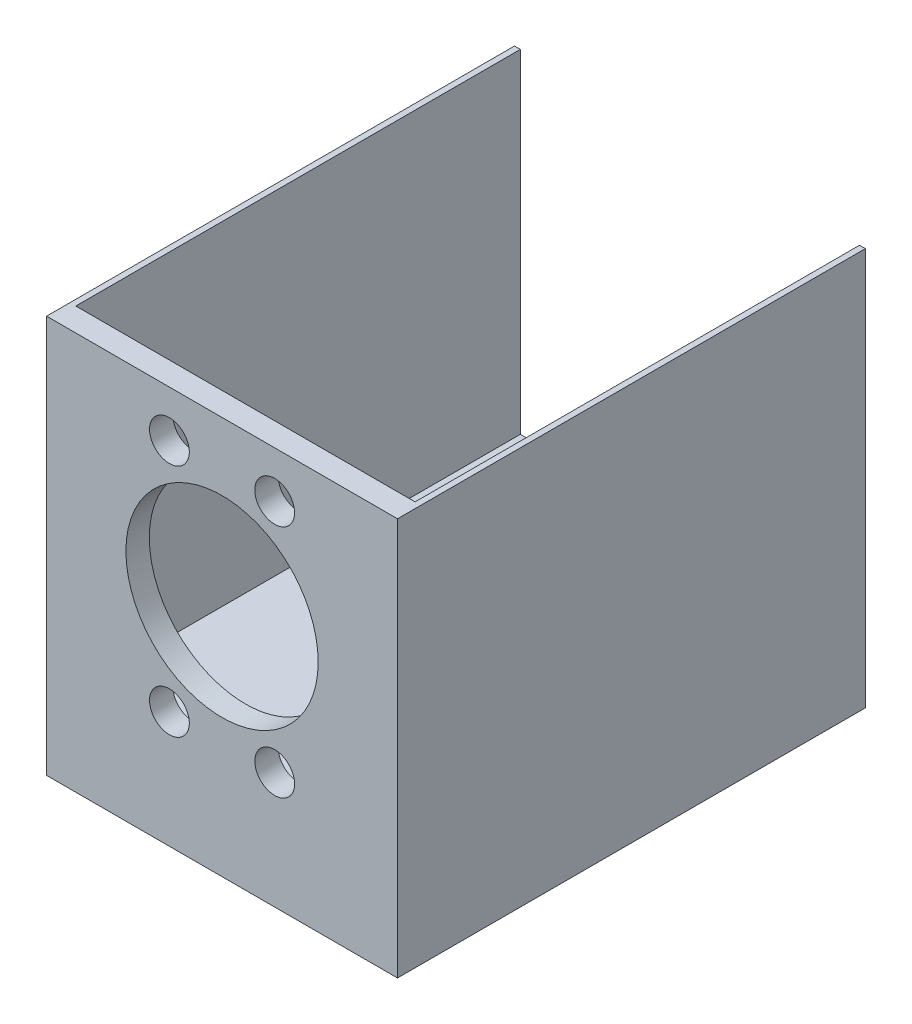
ISO-10303-21;
HEADER;
FILE_DESCRIPTION(('STEP AP214'),'2;1');
FILE_NAME('part.step','',(''),(''),'','','');
FILE_SCHEMA(('AUTOMOTIVE_DESIGN { 1 0 10303 214 1 1 1 1 }'));
ENDSEC;
DATA;
#1=APPLICATION_CONTEXT('core data for automotive mechanical design processes');
#2=APPLICATION_PROTOCOL_DEFINITION('international standard','automotive_design',2000,#1);
#3=PRODUCT_CONTEXT('',#1,'mechanical');
#4=PRODUCT('Part','Part','',(#3));
#5=PRODUCT_RELATED_PRODUCT_CATEGORY('part','',(#4));
#6=PRODUCT_DEFINITION_FORMATION('','',#4);
#7=PRODUCT_DEFINITION_CONTEXT('part definition',#1,'design');
#8=PRODUCT_DEFINITION('design','',#6,#7);
#9=PRODUCT_DEFINITION_SHAPE('','',#8);
#10=(LENGTH_UNIT() NAMED_UNIT(*) SI_UNIT(.MILLI.,.METRE.));
#11=(NAMED_UNIT(*) PLANE_ANGLE_UNIT() SI_UNIT($,.RADIAN.));
#12=(NAMED_UNIT(*) SI_UNIT($,.STERADIAN.) SOLID_ANGLE_UNIT());
#13=UNCERTAINTY_MEASURE_WITH_UNIT(LENGTH_MEASURE(1.E-05),#10,'distance_accuracy_value','');
#14=(GEOMETRIC_REPRESENTATION_CONTEXT(3) GLOBAL_UNCERTAINTY_ASSIGNED_CONTEXT((#13)) GLOBAL_UNIT_ASSIGNED_CONTEXT((#10,
#11,#12)) REPRESENTATION_CONTEXT('',''));
#15=CARTESIAN_POINT('',(0.,0.,0.));
#16=DIRECTION('',(0.,0.,1.));
#17=DIRECTION('',(1.,0.,0.));
#18=AXIS2_PLACEMENT_3D('',#15,#16,#17);
#19=CARTESIAN_POINT('',(15.,-15.,-40.));
#20=DIRECTION('',(1.,0.,0.));
#21=DIRECTION('',(0.,0.,-1.));
#22=AXIS2_PLACEMENT_3D('',#19,#20,#21);
#23=PLANE('',#22);
#24=DIRECTION('',(0.,1.,0.));
#25=VECTOR('',#24,1.);
#26=CARTESIAN_POINT('',(15.,-15.,-40.));
#27=LINE('',#26,#25);
#28=CARTESIAN_POINT('',(15.,-20.,-40.));
#29=VERTEX_POINT('',#28);
#30=CARTESIAN_POINT('',(15.,14.,-40.));
#31=VERTEX_POINT('',#30);
#32=EDGE_CURVE('E111',#29,#31,#27,.T.);
#33=ORIENTED_EDGE('',*,*,#32,.T.);
#34=DIRECTION('',(0.,0.,-1.));
#35=VECTOR('',#34,1.);
#36=CARTESIAN_POINT('',(15.,14.,-40.));
#37=LINE('',#36,#35);
#38=CARTESIAN_POINT('',(15.,14.,0.));
#39=VERTEX_POINT('',#38);
#40=EDGE_CURVE('E154',#39,#31,#37,.T.);
#41=ORIENTED_EDGE('',*,*,#40,.F.);
#42=DIRECTION('',(0.,1.,0.));
#43=VECTOR('',#42,1.);
#44=CARTESIAN_POINT('',(15.,-15.,0.));
#45=LINE('',#44,#43);
#46=CARTESIAN_POINT('',(15.,-20.,0.));
#47=VERTEX_POINT('',#46);
#48=EDGE_CURVE('E83',#47,#39,#45,.T.);
#49=ORIENTED_EDGE('',*,*,#48,.F.);
#50=DIRECTION('',(0.,0.,1.));
#51=VECTOR('',#50,1.);
#52=CARTESIAN_POINT('',(15.,-20.,0.));
#53=LINE('',#52,#51);
#54=EDGE_CURVE('E205',#29,#47,#53,.T.);
#55=ORIENTED_EDGE('',*,*,#54,.F.);
#56=EDGE_LOOP('',(#33,#41,#49,#55));
#57=FACE_BOUND('',#56,.T.);
#58=ADVANCED_FACE('F39',(#57),#23,.T.);
#59=CARTESIAN_POINT('',(-15.,-15.,-40.));
#60=DIRECTION('',(-1.,0.,0.));
#61=DIRECTION('',(0.,0.,1.));
#62=AXIS2_PLACEMENT_3D('',#59,#60,#61);
#63=PLANE('',#62);
#64=DIRECTION('',(0.,-1.,0.));
#65=VECTOR('',#64,1.);
#66=CARTESIAN_POINT('',(-15.,-15.,0.));
#67=LINE('',#66,#65);
#68=CARTESIAN_POINT('',(-15.,14.,0.));
#69=VERTEX_POINT('',#68);
#70=CARTESIAN_POINT('',(-15.,-20.,0.));
#71=VERTEX_POINT('',#70);
#72=EDGE_CURVE('E114',#69,#71,#67,.T.);
#73=ORIENTED_EDGE('',*,*,#72,.F.);
#74=DIRECTION('',(0.,0.,1.));
#75=VECTOR('',#74,1.);
#76=CARTESIAN_POINT('',(-15.,14.,-40.));
#77=LINE('',#76,#75);
#78=CARTESIAN_POINT('',(-15.,14.,-40.));
#79=VERTEX_POINT('',#78);
#80=EDGE_CURVE('E144',#79,#69,#77,.T.);
#81=ORIENTED_EDGE('',*,*,#80,.F.);
#82=DIRECTION('',(0.,-1.,0.));
#83=VECTOR('',#82,1.);
#84=CARTESIAN_POINT('',(-15.,-15.,-40.));
#85=LINE('',#84,#83);
#86=CARTESIAN_POINT('',(-15.,-20.,-40.));
#87=VERTEX_POINT('',#86);
#88=EDGE_CURVE('E47',#79,#87,#85,.T.);
#89=ORIENTED_EDGE('',*,*,#88,.T.);
#90=DIRECTION('',(0.,0.,-1.));
#91=VECTOR('',#90,1.);
#92=CARTESIAN_POINT('',(-15.,-20.,-40.));
#93=LINE('',#92,#91);
#94=EDGE_CURVE('E214',#71,#87,#93,.T.);
#95=ORIENTED_EDGE('',*,*,#94,.F.);
#96=EDGE_LOOP('',(#73,#81,#89,#95));
#97=FACE_BOUND('',#96,.T.);
#98=ADVANCED_FACE('F287',(#97),#63,.T.);
#99=CARTESIAN_POINT('',(0.,0.,-40.));
#100=DIRECTION('',(0.,0.,-1.));
#101=DIRECTION('',(-1.,0.,0.));
#102=AXIS2_PLACEMENT_3D('',#99,#100,#101);
#103=PLANE('',#102);
#104=ORIENTED_EDGE('',*,*,#88,.F.);
#105=DIRECTION('',(-1.,0.,0.));
#106=VECTOR('',#105,1.);
#107=CARTESIAN_POINT('',(-15.,14.,-40.));
#108=LINE('',#107,#106);
#109=CARTESIAN_POINT('',(-14.5,14.,-40.));
#110=VERTEX_POINT('',#109);
#111=EDGE_CURVE('E99',#110,#79,#108,.T.);
#112=ORIENTED_EDGE('',*,*,#111,.F.);
#113=DIRECTION('',(0.,1.,0.));
#114=VECTOR('',#113,1.);
#115=CARTESIAN_POINT('',(-14.5,-14.5,-40.));
#116=LINE('',#115,#114);
#117=CARTESIAN_POINT('',(-14.5,-14.5,-40.));
#118=VERTEX_POINT('',#117);
#119=EDGE_CURVE('E79',#118,#110,#116,.T.);
#120=ORIENTED_EDGE('',*,*,#119,.F.);
#121=DIRECTION('',(-1.,0.,0.));
#122=VECTOR('',#121,1.);
#123=CARTESIAN_POINT('',(14.5,-14.5,-40.));
#124=LINE('',#123,#122);
#125=CARTESIAN_POINT('',(14.5,-14.5,-40.));
#126=VERTEX_POINT('',#125);
#127=EDGE_CURVE('E88',#126,#118,#124,.T.);
#128=ORIENTED_EDGE('',*,*,#127,.F.);
#129=DIRECTION('',(0.,-1.,0.));
#130=VECTOR('',#129,1.);
#131=CARTESIAN_POINT('',(14.5,-14.5,-40.));
#132=LINE('',#131,#130);
#133=CARTESIAN_POINT('',(14.5,14.,-40.));
#134=VERTEX_POINT('',#133);
#135=EDGE_CURVE('E93',#134,#126,#132,.T.);
#136=ORIENTED_EDGE('',*,*,#135,.F.);
#137=EDGE_CURVE('E162',#31,#134,#108,.T.);
#138=ORIENTED_EDGE('',*,*,#137,.F.);
#139=ORIENTED_EDGE('',*,*,#32,.F.);
#140=DIRECTION('',(1.,0.,0.));
#141=VECTOR('',#140,1.);
#142=CARTESIAN_POINT('',(-14.5,-20.,-40.));
#143=LINE('',#142,#141);
#144=EDGE_CURVE('E220',#87,#29,#143,.T.);
#145=ORIENTED_EDGE('',*,*,#144,.F.);
#146=EDGE_LOOP('',(#104,#112,#120,#128,#136,#138,#139,#145));
#147=FACE_BOUND('',#146,.T.);
#148=ADVANCED_FACE('F97',(#147),#103,.T.);
#149=CARTESIAN_POINT('',(0.,0.,0.));
#150=DIRECTION('',(0.,0.,-1.));
#151=DIRECTION('',(-1.,0.,0.));
#152=AXIS2_PLACEMENT_3D('',#149,#150,#151);
#153=PLANE('',#152);
#154=CARTESIAN_POINT('',(1.13743898277129E-13,0.,0.));
#155=DIRECTION('',(0.,0.,-1.));
#156=DIRECTION('',(-1.,0.,0.));
#157=AXIS2_PLACEMENT_3D('',#154,#155,#156);
#158=CIRCLE('',#157,8.21779709980826);
#159=CARTESIAN_POINT('',(-8.21779709980814,0.,0.));
#160=VERTEX_POINT('',#159);
#161=EDGE_CURVE('E137',#160,#160,#158,.T.);
#162=ORIENTED_EDGE('',*,*,#161,.T.);
#163=EDGE_LOOP('',(#162));
#164=FACE_BOUND('',#163,.T.);
#165=CARTESIAN_POINT('',(-4.5,-10.0374299499424,0.));
#166=DIRECTION('',(0.,0.,-1.));
#167=DIRECTION('',(-1.,0.,0.));
#168=AXIS2_PLACEMENT_3D('',#165,#166,#167);
#169=CIRCLE('',#168,1.69999999999999);
#170=CARTESIAN_POINT('',(-6.19999999999999,-10.0374299499424,0.));
#171=VERTEX_POINT('',#170);
#172=EDGE_CURVE('E104',#171,#171,#169,.T.);
#173=ORIENTED_EDGE('',*,*,#172,.T.);
#174=EDGE_LOOP('',(#173));
#175=FACE_BOUND('',#174,.T.);
#176=CARTESIAN_POINT('',(4.5,-10.0374299499424,0.));
#177=DIRECTION('',(0.,0.,-1.));
#178=DIRECTION('',(-1.,0.,0.));
#179=AXIS2_PLACEMENT_3D('',#176,#177,#178);
#180=CIRCLE('',#179,1.69999999999999);
#181=CARTESIAN_POINT('',(2.80000000000001,-10.0374299499424,0.));
#182=VERTEX_POINT('',#181);
#183=EDGE_CURVE('E124',#182,#182,#180,.T.);
#184=ORIENTED_EDGE('',*,*,#183,.T.);
#185=EDGE_LOOP('',(#184));
#186=FACE_BOUND('',#185,.T.);
#187=CARTESIAN_POINT('',(4.5,10.0374299499424,0.));
#188=DIRECTION('',(0.,0.,-1.));
#189=DIRECTION('',(-1.,0.,0.));
#190=AXIS2_PLACEMENT_3D('',#187,#188,#189);
#191=CIRCLE('',#190,1.69999999999999);
#192=CARTESIAN_POINT('',(2.80000000000001,10.0374299499424,0.));
#193=VERTEX_POINT('',#192);
#194=EDGE_CURVE('E128',#193,#193,#191,.T.);
#195=ORIENTED_EDGE('',*,*,#194,.T.);
#196=EDGE_LOOP('',(#195));
#197=FACE_BOUND('',#196,.T.);
#198=CARTESIAN_POINT('',(-4.5,10.0374299499424,0.));
#199=DIRECTION('',(0.,0.,-1.));
#200=DIRECTION('',(-1.,0.,0.));
#201=AXIS2_PLACEMENT_3D('',#198,#199,#200);
#202=CIRCLE('',#201,1.69999999999999);
#203=CARTESIAN_POINT('',(-6.19999999999999,10.0374299499424,0.));
#204=VERTEX_POINT('',#203);
#205=EDGE_CURVE('E131',#204,#204,#202,.T.);
#206=ORIENTED_EDGE('',*,*,#205,.T.);
#207=EDGE_LOOP('',(#206));
#208=FACE_BOUND('',#207,.T.);
#209=DIRECTION('',(1.,0.,0.));
#210=VECTOR('',#209,1.);
#211=CARTESIAN_POINT('',(-15.,14.,0.));
#212=LINE('',#211,#210);
#213=EDGE_CURVE('E148',#69,#39,#212,.T.);
#214=ORIENTED_EDGE('',*,*,#213,.F.);
#215=ORIENTED_EDGE('',*,*,#72,.T.);
#216=DIRECTION('',(-1.,0.,0.));
#217=VECTOR('',#216,1.);
#218=CARTESIAN_POINT('',(-15.,-20.,0.));
#219=LINE('',#218,#217);
#220=EDGE_CURVE('E208',#47,#71,#219,.T.);
#221=ORIENTED_EDGE('',*,*,#220,.F.);
#222=ORIENTED_EDGE('',*,*,#48,.T.);
#223=EDGE_LOOP('',(#214,#215,#221,#222));
#224=FACE_BOUND('',#223,.T.);
#225=ADVANCED_FACE('F209',(#164,#175,#186,#197,#208,#224),#153,.F.);
#226=CARTESIAN_POINT('',(-14.5,-14.5,-2.));
#227=DIRECTION('',(-1.,0.,0.));
#228=DIRECTION('',(0.,0.,1.));
#229=AXIS2_PLACEMENT_3D('',#226,#227,#228);
#230=PLANE('',#229);
#231=DIRECTION('',(0.,0.,-1.));
#232=VECTOR('',#231,1.);
#233=CARTESIAN_POINT('',(-14.5,14.,-2.));
#234=LINE('',#233,#232);
#235=CARTESIAN_POINT('',(-14.5,14.,-2.));
#236=VERTEX_POINT('',#235);
#237=EDGE_CURVE('E165',#236,#110,#234,.T.);
#238=ORIENTED_EDGE('',*,*,#237,.F.);
#239=DIRECTION('',(0.,1.,0.));
#240=VECTOR('',#239,1.);
#241=CARTESIAN_POINT('',(-14.5,-14.5,-2.));
#242=LINE('',#241,#240);
#243=CARTESIAN_POINT('',(-14.5,-14.5,-2.));
#244=VERTEX_POINT('',#243);
#245=EDGE_CURVE('E81',#244,#236,#242,.T.);
#246=ORIENTED_EDGE('',*,*,#245,.F.);
#247=DIRECTION('',(0.,0.,-1.));
#248=VECTOR('',#247,1.);
#249=CARTESIAN_POINT('',(-14.5,-14.5,-2.));
#250=LINE('',#249,#248);
#251=EDGE_CURVE('E63',#244,#118,#250,.T.);
#252=ORIENTED_EDGE('',*,*,#251,.T.);
#253=ORIENTED_EDGE('',*,*,#119,.T.);
#254=EDGE_LOOP('',(#238,#246,#252,#253));
#255=FACE_BOUND('',#254,.T.);
#256=ADVANCED_FACE('F76',(#255),#230,.F.);
#257=CARTESIAN_POINT('',(14.5,-14.5,-2.));
#258=DIRECTION('',(1.,0.,0.));
#259=DIRECTION('',(0.,0.,-1.));
#260=AXIS2_PLACEMENT_3D('',#257,#258,#259);
#261=PLANE('',#260);
#262=DIRECTION('',(0.,0.,1.));
#263=VECTOR('',#262,1.);
#264=CARTESIAN_POINT('',(14.5,14.,-2.));
#265=LINE('',#264,#263);
#266=CARTESIAN_POINT('',(14.5,14.,-2.));
#267=VERTEX_POINT('',#266);
#268=EDGE_CURVE('E54',#134,#267,#265,.T.);
#269=ORIENTED_EDGE('',*,*,#268,.F.);
#270=ORIENTED_EDGE('',*,*,#135,.T.);
#271=DIRECTION('',(0.,0.,-1.));
#272=VECTOR('',#271,1.);
#273=CARTESIAN_POINT('',(14.5,-14.5,-2.));
#274=LINE('',#273,#272);
#275=CARTESIAN_POINT('',(14.5,-14.5,-2.));
#276=VERTEX_POINT('',#275);
#277=EDGE_CURVE('E84',#276,#126,#274,.T.);
#278=ORIENTED_EDGE('',*,*,#277,.F.);
#279=DIRECTION('',(0.,-1.,0.));
#280=VECTOR('',#279,1.);
#281=CARTESIAN_POINT('',(14.5,-14.5,-2.));
#282=LINE('',#281,#280);
#283=EDGE_CURVE('E176',#267,#276,#282,.T.);
#284=ORIENTED_EDGE('',*,*,#283,.F.);
#285=EDGE_LOOP('',(#269,#270,#278,#284));
#286=FACE_BOUND('',#285,.T.);
#287=ADVANCED_FACE('F274',(#286),#261,.F.);
#288=CARTESIAN_POINT('',(0.,0.,-2.));
#289=DIRECTION('',(0.,0.,1.));
#290=DIRECTION('',(1.,0.,0.));
#291=AXIS2_PLACEMENT_3D('',#288,#289,#290);
#292=PLANE('',#291);
#293=CARTESIAN_POINT('',(1.13743898277129E-13,0.,-2.));
#294=DIRECTION('',(0.,0.,1.));
#295=DIRECTION('',(1.,0.,0.));
#296=AXIS2_PLACEMENT_3D('',#293,#294,#295);
#297=CIRCLE('',#296,8.21779709980826);
#298=CARTESIAN_POINT('',(8.21779709980837,0.,-2.));
#299=VERTEX_POINT('',#298);
#300=EDGE_CURVE('E42',#299,#299,#297,.T.);
#301=ORIENTED_EDGE('',*,*,#300,.T.);
#302=EDGE_LOOP('',(#301));
#303=FACE_BOUND('',#302,.T.);
#304=CARTESIAN_POINT('',(-4.5,-10.0374299499424,-2.));
#305=DIRECTION('',(0.,0.,1.));
#306=DIRECTION('',(1.,0.,0.));
#307=AXIS2_PLACEMENT_3D('',#304,#305,#306);
#308=CIRCLE('',#307,1.69999999999999);
#309=CARTESIAN_POINT('',(-2.8,-10.0374299499424,-2.));
#310=VERTEX_POINT('',#309);
#311=EDGE_CURVE('E100',#310,#310,#308,.T.);
#312=ORIENTED_EDGE('',*,*,#311,.T.);
#313=EDGE_LOOP('',(#312));
#314=FACE_BOUND('',#313,.T.);
#315=CARTESIAN_POINT('',(4.5,-10.0374299499424,-2.));
#316=DIRECTION('',(0.,0.,1.));
#317=DIRECTION('',(1.,0.,0.));
#318=AXIS2_PLACEMENT_3D('',#315,#316,#317);
#319=CIRCLE('',#318,1.69999999999999);
#320=CARTESIAN_POINT('',(6.2,-10.0374299499424,-2.));
#321=VERTEX_POINT('',#320);
#322=EDGE_CURVE('E121',#321,#321,#319,.T.);
#323=ORIENTED_EDGE('',*,*,#322,.T.);
#324=EDGE_LOOP('',(#323));
#325=FACE_BOUND('',#324,.T.);
#326=CARTESIAN_POINT('',(4.5,10.0374299499424,-2.));
#327=DIRECTION('',(0.,0.,1.));
#328=DIRECTION('',(1.,0.,0.));
#329=AXIS2_PLACEMENT_3D('',#326,#327,#328);
#330=CIRCLE('',#329,1.69999999999999);
#331=CARTESIAN_POINT('',(6.2,10.0374299499424,-2.));
#332=VERTEX_POINT('',#331);
#333=EDGE_CURVE('E125',#332,#332,#330,.T.);
#334=ORIENTED_EDGE('',*,*,#333,.T.);
#335=EDGE_LOOP('',(#334));
#336=FACE_BOUND('',#335,.T.);
#337=CARTESIAN_POINT('',(-4.5,10.0374299499424,-2.));
#338=DIRECTION('',(0.,0.,1.));
#339=DIRECTION('',(1.,0.,0.));
#340=AXIS2_PLACEMENT_3D('',#337,#338,#339);
#341=CIRCLE('',#340,1.69999999999999);
#342=CARTESIAN_POINT('',(-2.8,10.0374299499424,-2.));
#343=VERTEX_POINT('',#342);
#344=EDGE_CURVE('E129',#343,#343,#341,.T.);
#345=ORIENTED_EDGE('',*,*,#344,.T.);
#346=EDGE_LOOP('',(#345));
#347=FACE_BOUND('',#346,.T.);
#348=DIRECTION('',(-1.,0.,0.));
#349=VECTOR('',#348,1.);
#350=CARTESIAN_POINT('',(0.,14.,-2.));
#351=LINE('',#350,#349);
#352=EDGE_CURVE('E11',#267,#236,#351,.T.);
#353=ORIENTED_EDGE('',*,*,#352,.F.);
#354=ORIENTED_EDGE('',*,*,#283,.T.);
#355=DIRECTION('',(-1.,0.,0.));
#356=VECTOR('',#355,1.);
#357=CARTESIAN_POINT('',(14.5,-14.5,-2.));
#358=LINE('',#357,#356);
#359=EDGE_CURVE('E107',#276,#244,#358,.T.);
#360=ORIENTED_EDGE('',*,*,#359,.T.);
#361=ORIENTED_EDGE('',*,*,#245,.T.);
#362=EDGE_LOOP('',(#353,#354,#360,#361));
#363=FACE_BOUND('',#362,.T.);
#364=ADVANCED_FACE('F179',(#303,#314,#325,#336,#347,#363),#292,.F.);
#365=CARTESIAN_POINT('',(14.5,-14.5,-2.));
#366=DIRECTION('',(0.,-1.,0.));
#367=DIRECTION('',(0.,0.,-1.));
#368=AXIS2_PLACEMENT_3D('',#365,#366,#367);
#369=PLANE('',#368);
#370=CARTESIAN_POINT('',(12.,-14.5,-4.99999999999999));
#371=DIRECTION('',(0.,-1.,0.));
#372=DIRECTION('',(0.,0.,-1.));
#373=AXIS2_PLACEMENT_3D('',#370,#371,#372);
#374=CIRCLE('',#373,1.55);
#375=CARTESIAN_POINT('',(12.,-14.5,-6.54999999999999));
#376=VERTEX_POINT('',#375);
#377=EDGE_CURVE('E142',#376,#376,#374,.T.);
#378=ORIENTED_EDGE('',*,*,#377,.T.);
#379=EDGE_LOOP('',(#378));
#380=FACE_BOUND('',#379,.T.);
#381=CARTESIAN_POINT('',(12.,-14.5,-37.));
#382=DIRECTION('',(0.,-1.,0.));
#383=DIRECTION('',(0.,0.,-1.));
#384=AXIS2_PLACEMENT_3D('',#381,#382,#383);
#385=CIRCLE('',#384,1.55);
#386=CARTESIAN_POINT('',(12.,-14.5,-38.55));
#387=VERTEX_POINT('',#386);
#388=EDGE_CURVE('E140',#387,#387,#385,.T.);
#389=ORIENTED_EDGE('',*,*,#388,.T.);
#390=EDGE_LOOP('',(#389));
#391=FACE_BOUND('',#390,.T.);
#392=CARTESIAN_POINT('',(-12.,-14.5,-37.));
#393=DIRECTION('',(0.,-1.,0.));
#394=DIRECTION('',(0.,0.,-1.));
#395=AXIS2_PLACEMENT_3D('',#392,#393,#394);
#396=CIRCLE('',#395,1.55);
#397=CARTESIAN_POINT('',(-12.,-14.5,-38.55));
#398=VERTEX_POINT('',#397);
#399=EDGE_CURVE('E136',#398,#398,#396,.T.);
#400=ORIENTED_EDGE('',*,*,#399,.T.);
#401=EDGE_LOOP('',(#400));
#402=FACE_BOUND('',#401,.T.);
#403=CARTESIAN_POINT('',(-12.,-14.5,-5.));
#404=DIRECTION('',(0.,-1.,0.));
#405=DIRECTION('',(0.,0.,-1.));
#406=AXIS2_PLACEMENT_3D('',#403,#404,#405);
#407=CIRCLE('',#406,1.55);
#408=CARTESIAN_POINT('',(-12.,-14.5,-6.55));
#409=VERTEX_POINT('',#408);
#410=EDGE_CURVE('E133',#409,#409,#407,.T.);
#411=ORIENTED_EDGE('',*,*,#410,.T.);
#412=EDGE_LOOP('',(#411));
#413=FACE_BOUND('',#412,.T.);
#414=ORIENTED_EDGE('',*,*,#127,.T.);
#415=ORIENTED_EDGE('',*,*,#251,.F.);
#416=ORIENTED_EDGE('',*,*,#359,.F.);
#417=ORIENTED_EDGE('',*,*,#277,.T.);
#418=EDGE_LOOP('',(#414,#415,#416,#417));
#419=FACE_BOUND('',#418,.T.);
#420=ADVANCED_FACE('F89',(#380,#391,#402,#413,#419),#369,.F.);
#421=CARTESIAN_POINT('',(-4.5,-10.0374299499424,-40.));
#422=DIRECTION('',(0.,0.,-1.));
#423=DIRECTION('',(-1.,0.,0.));
#424=AXIS2_PLACEMENT_3D('',#421,#422,#423);
#425=CYLINDRICAL_SURFACE('',#424,1.69999999999999);
#426=ORIENTED_EDGE('',*,*,#172,.F.);
#427=EDGE_LOOP('',(#426));
#428=FACE_BOUND('',#427,.T.);
#429=ORIENTED_EDGE('',*,*,#311,.F.);
#430=EDGE_LOOP('',(#429));
#431=FACE_BOUND('',#430,.T.);
#432=ADVANCED_FACE('F280',(#428,#431),#425,.F.);
#433=CARTESIAN_POINT('',(4.5,-10.0374299499424,-40.));
#434=DIRECTION('',(0.,0.,-1.));
#435=DIRECTION('',(-1.,0.,0.));
#436=AXIS2_PLACEMENT_3D('',#433,#434,#435);
#437=CYLINDRICAL_SURFACE('',#436,1.69999999999999);
#438=ORIENTED_EDGE('',*,*,#183,.F.);
#439=EDGE_LOOP('',(#438));
#440=FACE_BOUND('',#439,.T.);
#441=ORIENTED_EDGE('',*,*,#322,.F.);
#442=EDGE_LOOP('',(#441));
#443=FACE_BOUND('',#442,.T.);
#444=ADVANCED_FACE('F480',(#440,#443),#437,.F.);
#445=CARTESIAN_POINT('',(4.5,10.0374299499424,-40.));
#446=DIRECTION('',(0.,0.,-1.));
#447=DIRECTION('',(-1.,0.,0.));
#448=AXIS2_PLACEMENT_3D('',#445,#446,#447);
#449=CYLINDRICAL_SURFACE('',#448,1.69999999999999);
#450=ORIENTED_EDGE('',*,*,#194,.F.);
#451=EDGE_LOOP('',(#450));
#452=FACE_BOUND('',#451,.T.);
#453=ORIENTED_EDGE('',*,*,#333,.F.);
#454=EDGE_LOOP('',(#453));
#455=FACE_BOUND('',#454,.T.);
#456=ADVANCED_FACE('F269',(#452,#455),#449,.F.);
#457=CARTESIAN_POINT('',(-4.5,10.0374299499424,-40.));
#458=DIRECTION('',(0.,0.,-1.));
#459=DIRECTION('',(-1.,0.,0.));
#460=AXIS2_PLACEMENT_3D('',#457,#458,#459);
#461=CYLINDRICAL_SURFACE('',#460,1.69999999999999);
#462=ORIENTED_EDGE('',*,*,#205,.F.);
#463=EDGE_LOOP('',(#462));
#464=FACE_BOUND('',#463,.T.);
#465=ORIENTED_EDGE('',*,*,#344,.F.);
#466=EDGE_LOOP('',(#465));
#467=FACE_BOUND('',#466,.T.);
#468=ADVANCED_FACE('F265',(#464,#467),#461,.F.);
#469=CARTESIAN_POINT('',(0.,14.,0.));
#470=DIRECTION('',(0.,1.,0.));
#471=DIRECTION('',(0.,0.,1.));
#472=AXIS2_PLACEMENT_3D('',#469,#470,#471);
#473=PLANE('',#472);
#474=ORIENTED_EDGE('',*,*,#237,.T.);
#475=ORIENTED_EDGE('',*,*,#111,.T.);
#476=ORIENTED_EDGE('',*,*,#80,.T.);
#477=ORIENTED_EDGE('',*,*,#213,.T.);
#478=ORIENTED_EDGE('',*,*,#40,.T.);
#479=ORIENTED_EDGE('',*,*,#137,.T.);
#480=ORIENTED_EDGE('',*,*,#268,.T.);
#481=ORIENTED_EDGE('',*,*,#352,.T.);
#482=EDGE_LOOP('',(#474,#475,#476,#477,#478,#479,#480,#481));
#483=FACE_BOUND('',#482,.T.);
#484=ADVANCED_FACE('F268',(#483),#473,.T.);
#485=CARTESIAN_POINT('',(-12.,-14.,-5.));
#486=DIRECTION('',(0.,-1.,0.));
#487=DIRECTION('',(0.,0.,-1.));
#488=AXIS2_PLACEMENT_3D('',#485,#486,#487);
#489=CYLINDRICAL_SURFACE('',#488,1.55);
#490=CARTESIAN_POINT('',(-12.,-15.,-5.));
#491=DIRECTION('',(0.,-1.,0.));
#492=DIRECTION('',(0.,0.,-1.));
#493=AXIS2_PLACEMENT_3D('',#490,#491,#492);
#494=CIRCLE('',#493,1.55);
#495=CARTESIAN_POINT('',(-12.,-15.,-6.55));
#496=VERTEX_POINT('',#495);
#497=EDGE_CURVE('E157',#496,#496,#494,.T.);
#498=ORIENTED_EDGE('',*,*,#497,.T.);
#499=EDGE_LOOP('',(#498));
#500=FACE_BOUND('',#499,.T.);
#501=ORIENTED_EDGE('',*,*,#410,.F.);
#502=EDGE_LOOP('',(#501));
#503=FACE_BOUND('',#502,.T.);
#504=ADVANCED_FACE('F313',(#500,#503),#489,.F.);
#505=CARTESIAN_POINT('',(-12.,-14.,-37.));
#506=DIRECTION('',(0.,-1.,0.));
#507=DIRECTION('',(0.,0.,-1.));
#508=AXIS2_PLACEMENT_3D('',#505,#506,#507);
#509=CYLINDRICAL_SURFACE('',#508,1.55);
#510=CARTESIAN_POINT('',(-12.,-15.,-37.));
#511=DIRECTION('',(0.,-1.,0.));
#512=DIRECTION('',(0.,0.,-1.));
#513=AXIS2_PLACEMENT_3D('',#510,#511,#512);
#514=CIRCLE('',#513,1.55);
#515=CARTESIAN_POINT('',(-12.,-15.,-38.55));
#516=VERTEX_POINT('',#515);
#517=EDGE_CURVE('E232',#516,#516,#514,.T.);
#518=ORIENTED_EDGE('',*,*,#517,.T.);
#519=EDGE_LOOP('',(#518));
#520=FACE_BOUND('',#519,.T.);
#521=ORIENTED_EDGE('',*,*,#399,.F.);
#522=EDGE_LOOP('',(#521));
#523=FACE_BOUND('',#522,.T.);
#524=ADVANCED_FACE('F329',(#520,#523),#509,.F.);
#525=CARTESIAN_POINT('',(12.,-14.,-37.));
#526=DIRECTION('',(0.,-1.,0.));
#527=DIRECTION('',(0.,0.,-1.));
#528=AXIS2_PLACEMENT_3D('',#525,#526,#527);
#529=CYLINDRICAL_SURFACE('',#528,1.55);
#530=CARTESIAN_POINT('',(12.,-15.,-37.));
#531=DIRECTION('',(0.,-1.,0.));
#532=DIRECTION('',(0.,0.,1.));
#533=AXIS2_PLACEMENT_3D('',#530,#531,#532);
#534=CIRCLE('',#533,1.55);
#535=CARTESIAN_POINT('',(12.,-15.,-35.45));
#536=VERTEX_POINT('',#535);
#537=EDGE_CURVE('E235',#536,#536,#534,.T.);
#538=ORIENTED_EDGE('',*,*,#537,.T.);
#539=EDGE_LOOP('',(#538));
#540=FACE_BOUND('',#539,.T.);
#541=ORIENTED_EDGE('',*,*,#388,.F.);
#542=EDGE_LOOP('',(#541));
#543=FACE_BOUND('',#542,.T.);
#544=ADVANCED_FACE('F338',(#540,#543),#529,.F.);
#545=CARTESIAN_POINT('',(12.,-14.,-4.99999999999999));
#546=DIRECTION('',(0.,-1.,0.));
#547=DIRECTION('',(0.,0.,-1.));
#548=AXIS2_PLACEMENT_3D('',#545,#546,#547);
#549=CYLINDRICAL_SURFACE('',#548,1.55);
#550=CARTESIAN_POINT('',(12.,-15.,-4.99999999999999));
#551=DIRECTION('',(0.,-1.,0.));
#552=DIRECTION('',(0.,0.,1.));
#553=AXIS2_PLACEMENT_3D('',#550,#551,#552);
#554=CIRCLE('',#553,1.55);
#555=CARTESIAN_POINT('',(12.,-15.,-3.45));
#556=VERTEX_POINT('',#555);
#557=EDGE_CURVE('E237',#556,#556,#554,.T.);
#558=ORIENTED_EDGE('',*,*,#557,.T.);
#559=EDGE_LOOP('',(#558));
#560=FACE_BOUND('',#559,.T.);
#561=ORIENTED_EDGE('',*,*,#377,.F.);
#562=EDGE_LOOP('',(#561));
#563=FACE_BOUND('',#562,.T.);
#564=ADVANCED_FACE('F250',(#560,#563),#549,.F.);
#565=CARTESIAN_POINT('',(1.13743898277129E-13,0.,-40.));
#566=DIRECTION('',(0.,0.,1.));
#567=DIRECTION('',(1.,0.,0.));
#568=AXIS2_PLACEMENT_3D('',#565,#566,#567);
#569=CYLINDRICAL_SURFACE('',#568,8.21779709980826);
#570=ORIENTED_EDGE('',*,*,#300,.F.);
#571=EDGE_LOOP('',(#570));
#572=FACE_BOUND('',#571,.T.);
#573=ORIENTED_EDGE('',*,*,#161,.F.);
#574=EDGE_LOOP('',(#573));
#575=FACE_BOUND('',#574,.T.);
#576=ADVANCED_FACE('F246',(#572,#575),#569,.F.);
#577=CARTESIAN_POINT('',(0.,-15.,0.));
#578=DIRECTION('',(0.,1.,0.));
#579=DIRECTION('',(0.,0.,1.));
#580=AXIS2_PLACEMENT_3D('',#577,#578,#579);
#581=PLANE('',#580);
#582=CARTESIAN_POINT('',(12.,-15.,-4.99999999999999));
#583=DIRECTION('',(0.,-1.,0.));
#584=DIRECTION('',(0.,0.,-1.));
#585=AXIS2_PLACEMENT_3D('',#582,#583,#584);
#586=CIRCLE('',#585,1.51799898565527);
#587=CARTESIAN_POINT('',(12.,-15.,-6.51799898565527));
#588=VERTEX_POINT('',#587);
#589=EDGE_CURVE('E544',#588,#588,#586,.T.);
#590=ORIENTED_EDGE('',*,*,#589,.T.);
#591=EDGE_LOOP('',(#590));
#592=FACE_BOUND('',#591,.T.);
#593=ORIENTED_EDGE('',*,*,#557,.F.);
#594=EDGE_LOOP('',(#593));
#595=FACE_BOUND('',#594,.T.);
#596=ADVANCED_FACE('F249',(#592,#595),#581,.T.);
#597=CARTESIAN_POINT('',(12.,-15.,-37.));
#598=DIRECTION('',(0.,-1.,0.));
#599=DIRECTION('',(0.,0.,-1.));
#600=AXIS2_PLACEMENT_3D('',#597,#598,#599);
#601=CIRCLE('',#600,1.5);
#602=CARTESIAN_POINT('',(12.,-15.,-38.5));
#603=VERTEX_POINT('',#602);
#604=EDGE_CURVE('E536',#603,#603,#601,.T.);
#605=ORIENTED_EDGE('',*,*,#604,.T.);
#606=EDGE_LOOP('',(#605));
#607=FACE_BOUND('',#606,.T.);
#608=ORIENTED_EDGE('',*,*,#537,.F.);
#609=EDGE_LOOP('',(#608));
#610=FACE_BOUND('',#609,.T.);
#611=ADVANCED_FACE('F398',(#607,#610),#581,.T.);
#612=CARTESIAN_POINT('',(-12.,-15.,-37.));
#613=DIRECTION('',(0.,-1.,0.));
#614=DIRECTION('',(0.,0.,-1.));
#615=AXIS2_PLACEMENT_3D('',#612,#613,#614);
#616=CIRCLE('',#615,1.5);
#617=CARTESIAN_POINT('',(-12.,-15.,-38.5));
#618=VERTEX_POINT('',#617);
#619=EDGE_CURVE('E538',#618,#618,#616,.T.);
#620=ORIENTED_EDGE('',*,*,#619,.T.);
#621=EDGE_LOOP('',(#620));
#622=FACE_BOUND('',#621,.T.);
#623=ORIENTED_EDGE('',*,*,#517,.F.);
#624=EDGE_LOOP('',(#623));
#625=FACE_BOUND('',#624,.T.);
#626=ADVANCED_FACE('F409',(#622,#625),#581,.T.);
#627=CARTESIAN_POINT('',(-12.,-15.,-5.));
#628=DIRECTION('',(0.,-1.,0.));
#629=DIRECTION('',(0.,0.,-1.));
#630=AXIS2_PLACEMENT_3D('',#627,#628,#629);
#631=CIRCLE('',#630,1.5);
#632=CARTESIAN_POINT('',(-12.,-15.,-6.5));
#633=VERTEX_POINT('',#632);
#634=EDGE_CURVE('E224',#633,#633,#631,.T.);
#635=ORIENTED_EDGE('',*,*,#634,.T.);
#636=EDGE_LOOP('',(#635));
#637=FACE_BOUND('',#636,.T.);
#638=ORIENTED_EDGE('',*,*,#497,.F.);
#639=EDGE_LOOP('',(#638));
#640=FACE_BOUND('',#639,.T.);
#641=ADVANCED_FACE('F401',(#637,#640),#581,.T.);
#642=CARTESIAN_POINT('',(0.,-20.,0.));
#643=DIRECTION('',(0.,1.,0.));
#644=DIRECTION('',(0.,0.,1.));
#645=AXIS2_PLACEMENT_3D('',#642,#643,#644);
#646=PLANE('',#645);
#647=ORIENTED_EDGE('',*,*,#54,.T.);
#648=ORIENTED_EDGE('',*,*,#220,.T.);
#649=ORIENTED_EDGE('',*,*,#94,.T.);
#650=ORIENTED_EDGE('',*,*,#144,.T.);
#651=EDGE_LOOP('',(#647,#648,#649,#650));
#652=FACE_BOUND('',#651,.T.);
#653=CARTESIAN_POINT('',(-12.,-20.,-5.));
#654=DIRECTION('',(0.,-1.,0.));
#655=DIRECTION('',(0.,0.,-1.));
#656=AXIS2_PLACEMENT_3D('',#653,#654,#655);
#657=CIRCLE('',#656,1.5);
#658=CARTESIAN_POINT('',(-12.,-20.,-6.5));
#659=VERTEX_POINT('',#658);
#660=EDGE_CURVE('E221',#659,#659,#657,.T.);
#661=ORIENTED_EDGE('',*,*,#660,.F.);
#662=EDGE_LOOP('',(#661));
#663=FACE_BOUND('',#662,.T.);
#664=CARTESIAN_POINT('',(12.,-20.,-4.99999999999999));
#665=DIRECTION('',(0.,-1.,0.));
#666=DIRECTION('',(0.,0.,-1.));
#667=AXIS2_PLACEMENT_3D('',#664,#665,#666);
#668=CIRCLE('',#667,1.51799898565527);
#669=CARTESIAN_POINT('',(12.,-20.,-6.51799898565527));
#670=VERTEX_POINT('',#669);
#671=EDGE_CURVE('E547',#670,#670,#668,.T.);
#672=ORIENTED_EDGE('',*,*,#671,.F.);
#673=EDGE_LOOP('',(#672));
#674=FACE_BOUND('',#673,.T.);
#675=CARTESIAN_POINT('',(-12.,-20.,-37.));
#676=DIRECTION('',(0.,-1.,0.));
#677=DIRECTION('',(0.,0.,-1.));
#678=AXIS2_PLACEMENT_3D('',#675,#676,#677);
#679=CIRCLE('',#678,1.5);
#680=CARTESIAN_POINT('',(-12.,-20.,-38.5));
#681=VERTEX_POINT('',#680);
#682=EDGE_CURVE('E541',#681,#681,#679,.T.);
#683=ORIENTED_EDGE('',*,*,#682,.F.);
#684=EDGE_LOOP('',(#683));
#685=FACE_BOUND('',#684,.T.);
#686=CARTESIAN_POINT('',(12.,-20.,-37.));
#687=DIRECTION('',(0.,-1.,0.));
#688=DIRECTION('',(0.,0.,-1.));
#689=AXIS2_PLACEMENT_3D('',#686,#687,#688);
#690=CIRCLE('',#689,1.5);
#691=CARTESIAN_POINT('',(12.,-20.,-38.5));
#692=VERTEX_POINT('',#691);
#693=EDGE_CURVE('E533',#692,#692,#690,.T.);
#694=ORIENTED_EDGE('',*,*,#693,.F.);
#695=EDGE_LOOP('',(#694));
#696=FACE_BOUND('',#695,.T.);
#697=ADVANCED_FACE('F217',(#652,#663,#674,#685,#696),#646,.F.);
#698=CARTESIAN_POINT('',(-12.,-20.,-5.));
#699=DIRECTION('',(0.,1.,0.));
#700=DIRECTION('',(0.,0.,1.));
#701=AXIS2_PLACEMENT_3D('',#698,#699,#700);
#702=CYLINDRICAL_SURFACE('',#701,1.5);
#703=ORIENTED_EDGE('',*,*,#660,.T.);
#704=EDGE_LOOP('',(#703));
#705=FACE_BOUND('',#704,.T.);
#706=ORIENTED_EDGE('',*,*,#634,.F.);
#707=EDGE_LOOP('',(#706));
#708=FACE_BOUND('',#707,.T.);
#709=ADVANCED_FACE('F434',(#705,#708),#702,.F.);
#710=CARTESIAN_POINT('',(12.,-20.,-4.99999999999999));
#711=DIRECTION('',(0.,1.,0.));
#712=DIRECTION('',(0.,0.,1.));
#713=AXIS2_PLACEMENT_3D('',#710,#711,#712);
#714=CYLINDRICAL_SURFACE('',#713,1.51799898565527);
#715=ORIENTED_EDGE('',*,*,#671,.T.);
#716=EDGE_LOOP('',(#715));
#717=FACE_BOUND('',#716,.T.);
#718=ORIENTED_EDGE('',*,*,#589,.F.);
#719=EDGE_LOOP('',(#718));
#720=FACE_BOUND('',#719,.T.);
#721=ADVANCED_FACE('F443',(#717,#720),#714,.F.);
#722=CARTESIAN_POINT('',(-12.,-20.,-37.));
#723=DIRECTION('',(0.,1.,0.));
#724=DIRECTION('',(0.,0.,1.));
#725=AXIS2_PLACEMENT_3D('',#722,#723,#724);
#726=CYLINDRICAL_SURFACE('',#725,1.5);
#727=ORIENTED_EDGE('',*,*,#682,.T.);
#728=EDGE_LOOP('',(#727));
#729=FACE_BOUND('',#728,.T.);
#730=ORIENTED_EDGE('',*,*,#619,.F.);
#731=EDGE_LOOP('',(#730));
#732=FACE_BOUND('',#731,.T.);
#733=ADVANCED_FACE('F453',(#729,#732),#726,.F.);
#734=CARTESIAN_POINT('',(12.,-20.,-37.));
#735=DIRECTION('',(0.,1.,0.));
#736=DIRECTION('',(0.,0.,1.));
#737=AXIS2_PLACEMENT_3D('',#734,#735,#736);
#738=CYLINDRICAL_SURFACE('',#737,1.5);
#739=ORIENTED_EDGE('',*,*,#693,.T.);
#740=EDGE_LOOP('',(#739));
#741=FACE_BOUND('',#740,.T.);
#742=ORIENTED_EDGE('',*,*,#604,.F.);
#743=EDGE_LOOP('',(#742));
#744=FACE_BOUND('',#743,.T.);
#745=ADVANCED_FACE('F463',(#741,#744),#738,.F.);
#746=CLOSED_SHELL('',(#58,#98,#148,#225,#256,#287,#364,#420,#432,#444,#456,#468,#484,#504,#524,
#544,#564,#576,#596,#611,#626,#641,#697,#709,#721,#733,#745));
#747=MANIFOLD_SOLID_BREP('B2',#746);
#748=ADVANCED_BREP_SHAPE_REPRESENTATION('',(#18,#747),#14);
#749=SHAPE_DEFINITION_REPRESENTATION(#9,#748);
ENDSEC;
END-ISO-10303-21;
